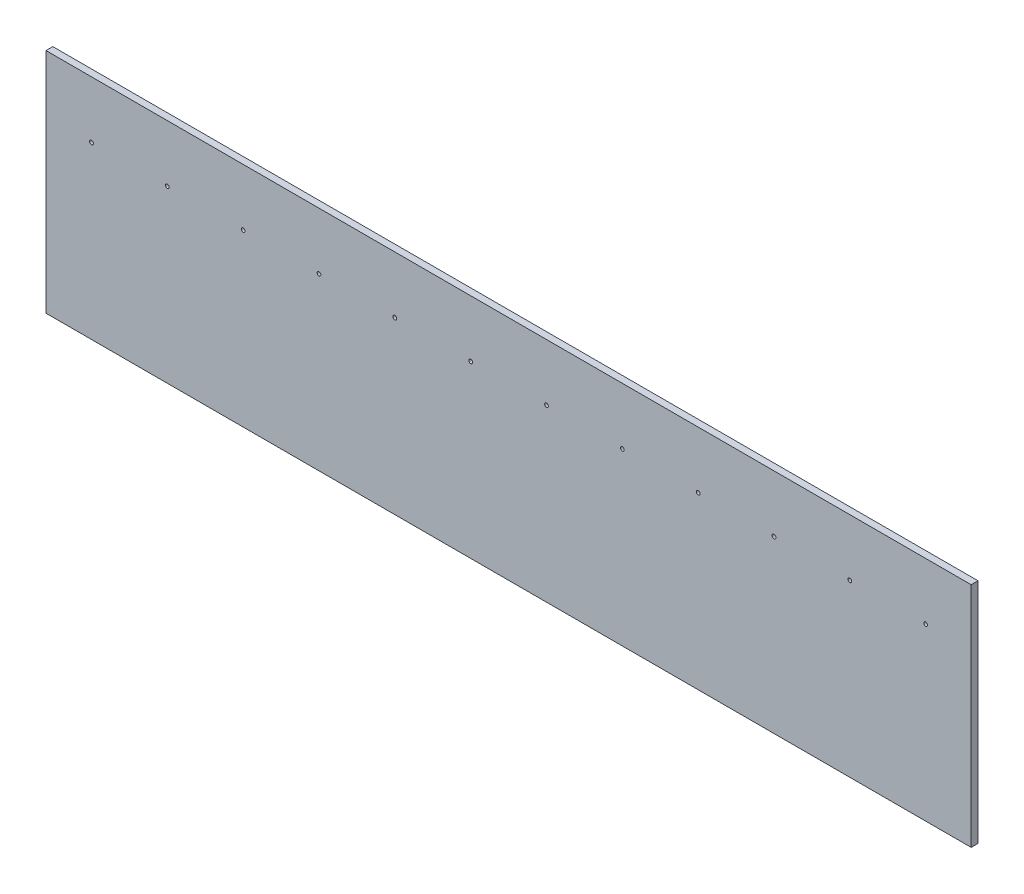
ISO-10303-21;
HEADER;
FILE_DESCRIPTION(('STEP AP214'),'2;1');
FILE_NAME('part.step','',(''),(''),'','','');
FILE_SCHEMA(('AUTOMOTIVE_DESIGN { 1 0 10303 214 1 1 1 1 }'));
ENDSEC;
DATA;
#1=APPLICATION_CONTEXT('core data for automotive mechanical design processes');
#2=APPLICATION_PROTOCOL_DEFINITION('international standard','automotive_design',2000,#1);
#3=PRODUCT_CONTEXT('',#1,'mechanical');
#4=PRODUCT('Part','Part','',(#3));
#5=PRODUCT_RELATED_PRODUCT_CATEGORY('part','',(#4));
#6=PRODUCT_DEFINITION_FORMATION('','',#4);
#7=PRODUCT_DEFINITION_CONTEXT('part definition',#1,'design');
#8=PRODUCT_DEFINITION('design','',#6,#7);
#9=PRODUCT_DEFINITION_SHAPE('','',#8);
#10=(LENGTH_UNIT() NAMED_UNIT(*) SI_UNIT(.MILLI.,.METRE.));
#11=(NAMED_UNIT(*) PLANE_ANGLE_UNIT() SI_UNIT($,.RADIAN.));
#12=(NAMED_UNIT(*) SI_UNIT($,.STERADIAN.) SOLID_ANGLE_UNIT());
#13=UNCERTAINTY_MEASURE_WITH_UNIT(LENGTH_MEASURE(1.E-05),#10,'distance_accuracy_value','');
#14=(GEOMETRIC_REPRESENTATION_CONTEXT(3) GLOBAL_UNCERTAINTY_ASSIGNED_CONTEXT((#13)) GLOBAL_UNIT_ASSIGNED_CONTEXT((#10,
#11,#12)) REPRESENTATION_CONTEXT('',''));
#15=CARTESIAN_POINT('',(0.,0.,0.));
#16=DIRECTION('',(0.,0.,1.));
#17=DIRECTION('',(1.,0.,0.));
#18=AXIS2_PLACEMENT_3D('',#15,#16,#17);
#19=CARTESIAN_POINT('',(0.,0.,18.));
#20=DIRECTION('',(0.,0.,-1.));
#21=DIRECTION('',(-1.,0.,0.));
#22=AXIS2_PLACEMENT_3D('',#19,#20,#21);
#23=PLANE('',#22);
#24=DIRECTION('',(0.,-1.,0.));
#25=VECTOR('',#24,1.);
#26=CARTESIAN_POINT('',(-789.743589743589,-341.025641025641,18.));
#27=LINE('',#26,#25);
#28=CARTESIAN_POINT('',(-789.743589743589,258.974358974359,18.));
#29=VERTEX_POINT('',#28);
#30=CARTESIAN_POINT('',(-789.743589743589,-341.025641025641,18.));
#31=VERTEX_POINT('',#30);
#32=EDGE_CURVE('E98',#29,#31,#27,.T.);
#33=ORIENTED_EDGE('',*,*,#32,.T.);
#34=DIRECTION('',(1.,0.,0.));
#35=VECTOR('',#34,1.);
#36=CARTESIAN_POINT('',(-789.743589743589,-341.025641025641,18.));
#37=LINE('',#36,#35);
#38=CARTESIAN_POINT('',(1650.25641025641,-341.025641025641,18.));
#39=VERTEX_POINT('',#38);
#40=EDGE_CURVE('E93',#31,#39,#37,.T.);
#41=ORIENTED_EDGE('',*,*,#40,.T.);
#42=DIRECTION('',(0.,1.,0.));
#43=VECTOR('',#42,1.);
#44=CARTESIAN_POINT('',(1650.25641025641,-341.025641025641,18.));
#45=LINE('',#44,#43);
#46=CARTESIAN_POINT('',(1650.25641025641,258.974358974359,18.));
#47=VERTEX_POINT('',#46);
#48=EDGE_CURVE('E96',#39,#47,#45,.T.);
#49=ORIENTED_EDGE('',*,*,#48,.T.);
#50=DIRECTION('',(-1.,0.,0.));
#51=VECTOR('',#50,1.);
#52=CARTESIAN_POINT('',(-789.743589743589,258.974358974359,18.));
#53=LINE('',#52,#51);
#54=EDGE_CURVE('E63',#47,#29,#53,.T.);
#55=ORIENTED_EDGE('',*,*,#54,.T.);
#56=EDGE_LOOP('',(#33,#41,#49,#55));
#57=FACE_BOUND('',#56,.T.);
#58=CARTESIAN_POINT('',(-669.743589743589,108.974358974359,18.));
#59=DIRECTION('',(0.,0.,1.));
#60=DIRECTION('',(1.,0.,0.));
#61=AXIS2_PLACEMENT_3D('',#58,#59,#60);
#62=CIRCLE('',#61,5.00000000000005);
#63=CARTESIAN_POINT('',(-664.743589743589,108.974358974359,18.));
#64=VERTEX_POINT('',#63);
#65=EDGE_CURVE('E118',#64,#64,#62,.T.);
#66=ORIENTED_EDGE('',*,*,#65,.F.);
#67=EDGE_LOOP('',(#66));
#68=FACE_BOUND('',#67,.T.);
#69=CARTESIAN_POINT('',(-469.743589743589,108.974358974359,18.));
#70=DIRECTION('',(0.,0.,1.));
#71=DIRECTION('',(1.,0.,0.));
#72=AXIS2_PLACEMENT_3D('',#69,#70,#71);
#73=CIRCLE('',#72,4.99999999999999);
#74=CARTESIAN_POINT('',(-464.743589743589,108.974358974359,18.));
#75=VERTEX_POINT('',#74);
#76=EDGE_CURVE('E140',#75,#75,#73,.T.);
#77=ORIENTED_EDGE('',*,*,#76,.F.);
#78=EDGE_LOOP('',(#77));
#79=FACE_BOUND('',#78,.T.);
#80=CARTESIAN_POINT('',(-269.743589743589,108.974358974359,18.));
#81=DIRECTION('',(0.,0.,1.));
#82=DIRECTION('',(1.,0.,0.));
#83=AXIS2_PLACEMENT_3D('',#80,#81,#82);
#84=CIRCLE('',#83,4.99999999999999);
#85=CARTESIAN_POINT('',(-264.743589743589,108.974358974359,18.));
#86=VERTEX_POINT('',#85);
#87=EDGE_CURVE('E148',#86,#86,#84,.T.);
#88=ORIENTED_EDGE('',*,*,#87,.F.);
#89=EDGE_LOOP('',(#88));
#90=FACE_BOUND('',#89,.T.);
#91=CARTESIAN_POINT('',(-69.7435897435892,108.974358974359,18.));
#92=DIRECTION('',(0.,0.,1.));
#93=DIRECTION('',(1.,0.,0.));
#94=AXIS2_PLACEMENT_3D('',#91,#92,#93);
#95=CIRCLE('',#94,5.00000000000001);
#96=CARTESIAN_POINT('',(-64.7435897435892,108.974358974359,18.));
#97=VERTEX_POINT('',#96);
#98=EDGE_CURVE('E156',#97,#97,#95,.T.);
#99=ORIENTED_EDGE('',*,*,#98,.F.);
#100=EDGE_LOOP('',(#99));
#101=FACE_BOUND('',#100,.T.);
#102=CARTESIAN_POINT('',(130.256410256411,108.974358974359,18.));
#103=DIRECTION('',(0.,0.,1.));
#104=DIRECTION('',(1.,0.,0.));
#105=AXIS2_PLACEMENT_3D('',#102,#103,#104);
#106=CIRCLE('',#105,4.99999999999999);
#107=CARTESIAN_POINT('',(135.256410256411,108.974358974359,18.));
#108=VERTEX_POINT('',#107);
#109=EDGE_CURVE('E164',#108,#108,#106,.T.);
#110=ORIENTED_EDGE('',*,*,#109,.F.);
#111=EDGE_LOOP('',(#110));
#112=FACE_BOUND('',#111,.T.);
#113=CARTESIAN_POINT('',(330.256410256411,108.974358974359,18.));
#114=DIRECTION('',(0.,0.,1.));
#115=DIRECTION('',(1.,0.,0.));
#116=AXIS2_PLACEMENT_3D('',#113,#114,#115);
#117=CIRCLE('',#116,4.99999999999999);
#118=CARTESIAN_POINT('',(335.256410256411,108.974358974359,18.));
#119=VERTEX_POINT('',#118);
#120=EDGE_CURVE('E172',#119,#119,#117,.T.);
#121=ORIENTED_EDGE('',*,*,#120,.F.);
#122=EDGE_LOOP('',(#121));
#123=FACE_BOUND('',#122,.T.);
#124=CARTESIAN_POINT('',(530.256410256411,108.974358974359,18.));
#125=DIRECTION('',(0.,0.,1.));
#126=DIRECTION('',(1.,0.,0.));
#127=AXIS2_PLACEMENT_3D('',#124,#125,#126);
#128=CIRCLE('',#127,5.00000000000005);
#129=CARTESIAN_POINT('',(535.256410256411,108.974358974359,18.));
#130=VERTEX_POINT('',#129);
#131=EDGE_CURVE('E180',#130,#130,#128,.T.);
#132=ORIENTED_EDGE('',*,*,#131,.F.);
#133=EDGE_LOOP('',(#132));
#134=FACE_BOUND('',#133,.T.);
#135=CARTESIAN_POINT('',(730.256410256411,108.974358974359,18.));
#136=DIRECTION('',(0.,0.,1.));
#137=DIRECTION('',(1.,0.,0.));
#138=AXIS2_PLACEMENT_3D('',#135,#136,#137);
#139=CIRCLE('',#138,5.00000000000005);
#140=CARTESIAN_POINT('',(735.256410256411,108.974358974359,18.));
#141=VERTEX_POINT('',#140);
#142=EDGE_CURVE('E188',#141,#141,#139,.T.);
#143=ORIENTED_EDGE('',*,*,#142,.F.);
#144=EDGE_LOOP('',(#143));
#145=FACE_BOUND('',#144,.T.);
#146=CARTESIAN_POINT('',(930.256410256411,108.974358974359,18.));
#147=DIRECTION('',(0.,0.,1.));
#148=DIRECTION('',(1.,0.,0.));
#149=AXIS2_PLACEMENT_3D('',#146,#147,#148);
#150=CIRCLE('',#149,5.00000000000005);
#151=CARTESIAN_POINT('',(935.256410256411,108.974358974359,18.));
#152=VERTEX_POINT('',#151);
#153=EDGE_CURVE('E196',#152,#152,#150,.T.);
#154=ORIENTED_EDGE('',*,*,#153,.F.);
#155=EDGE_LOOP('',(#154));
#156=FACE_BOUND('',#155,.T.);
#157=CARTESIAN_POINT('',(1130.25641025641,108.974358974359,18.));
#158=DIRECTION('',(0.,0.,1.));
#159=DIRECTION('',(1.,0.,0.));
#160=AXIS2_PLACEMENT_3D('',#157,#158,#159);
#161=CIRCLE('',#160,4.99999999999982);
#162=CARTESIAN_POINT('',(1135.25641025641,108.974358974359,18.));
#163=VERTEX_POINT('',#162);
#164=EDGE_CURVE('E204',#163,#163,#161,.T.);
#165=ORIENTED_EDGE('',*,*,#164,.F.);
#166=EDGE_LOOP('',(#165));
#167=FACE_BOUND('',#166,.T.);
#168=CARTESIAN_POINT('',(1330.25641025641,108.974358974359,18.));
#169=DIRECTION('',(0.,0.,1.));
#170=DIRECTION('',(1.,0.,0.));
#171=AXIS2_PLACEMENT_3D('',#168,#169,#170);
#172=CIRCLE('',#171,5.00000000000005);
#173=CARTESIAN_POINT('',(1335.25641025641,108.974358974359,18.));
#174=VERTEX_POINT('',#173);
#175=EDGE_CURVE('E212',#174,#174,#172,.T.);
#176=ORIENTED_EDGE('',*,*,#175,.F.);
#177=EDGE_LOOP('',(#176));
#178=FACE_BOUND('',#177,.T.);
#179=CARTESIAN_POINT('',(1530.25641025641,108.974358974359,18.));
#180=DIRECTION('',(0.,0.,1.));
#181=DIRECTION('',(1.,0.,0.));
#182=AXIS2_PLACEMENT_3D('',#179,#180,#181);
#183=CIRCLE('',#182,4.99999999999982);
#184=CARTESIAN_POINT('',(1535.25641025641,108.974358974359,18.));
#185=VERTEX_POINT('',#184);
#186=EDGE_CURVE('E220',#185,#185,#183,.T.);
#187=ORIENTED_EDGE('',*,*,#186,.F.);
#188=EDGE_LOOP('',(#187));
#189=FACE_BOUND('',#188,.T.);
#190=ADVANCED_FACE('F45',(#57,#68,#79,#90,#101,#112,#123,#134,#145,#156,#167,#178,#189),#23,.F.);
#191=CARTESIAN_POINT('',(0.,0.,0.));
#192=DIRECTION('',(0.,0.,-1.));
#193=DIRECTION('',(-1.,0.,0.));
#194=AXIS2_PLACEMENT_3D('',#191,#192,#193);
#195=PLANE('',#194);
#196=CARTESIAN_POINT('',(1330.25641025641,108.974358974359,0.));
#197=DIRECTION('',(0.,0.,1.));
#198=DIRECTION('',(1.,0.,0.));
#199=AXIS2_PLACEMENT_3D('',#196,#197,#198);
#200=CIRCLE('',#199,5.00000000000005);
#201=CARTESIAN_POINT('',(1335.25641025641,108.974358974359,0.));
#202=VERTEX_POINT('',#201);
#203=EDGE_CURVE('E216',#202,#202,#200,.T.);
#204=ORIENTED_EDGE('',*,*,#203,.T.);
#205=EDGE_LOOP('',(#204));
#206=FACE_BOUND('',#205,.T.);
#207=CARTESIAN_POINT('',(930.256410256411,108.974358974359,0.));
#208=DIRECTION('',(0.,0.,1.));
#209=DIRECTION('',(1.,0.,0.));
#210=AXIS2_PLACEMENT_3D('',#207,#208,#209);
#211=CIRCLE('',#210,5.00000000000005);
#212=CARTESIAN_POINT('',(935.256410256411,108.974358974359,0.));
#213=VERTEX_POINT('',#212);
#214=EDGE_CURVE('E200',#213,#213,#211,.T.);
#215=ORIENTED_EDGE('',*,*,#214,.T.);
#216=EDGE_LOOP('',(#215));
#217=FACE_BOUND('',#216,.T.);
#218=CARTESIAN_POINT('',(530.256410256411,108.974358974359,0.));
#219=DIRECTION('',(0.,0.,1.));
#220=DIRECTION('',(1.,0.,0.));
#221=AXIS2_PLACEMENT_3D('',#218,#219,#220);
#222=CIRCLE('',#221,5.00000000000005);
#223=CARTESIAN_POINT('',(535.256410256411,108.974358974359,0.));
#224=VERTEX_POINT('',#223);
#225=EDGE_CURVE('E184',#224,#224,#222,.T.);
#226=ORIENTED_EDGE('',*,*,#225,.T.);
#227=EDGE_LOOP('',(#226));
#228=FACE_BOUND('',#227,.T.);
#229=CARTESIAN_POINT('',(130.256410256411,108.974358974359,0.));
#230=DIRECTION('',(0.,0.,1.));
#231=DIRECTION('',(1.,0.,0.));
#232=AXIS2_PLACEMENT_3D('',#229,#230,#231);
#233=CIRCLE('',#232,4.99999999999999);
#234=CARTESIAN_POINT('',(135.256410256411,108.974358974359,0.));
#235=VERTEX_POINT('',#234);
#236=EDGE_CURVE('E168',#235,#235,#233,.T.);
#237=ORIENTED_EDGE('',*,*,#236,.T.);
#238=EDGE_LOOP('',(#237));
#239=FACE_BOUND('',#238,.T.);
#240=CARTESIAN_POINT('',(-269.743589743589,108.974358974359,0.));
#241=DIRECTION('',(0.,0.,1.));
#242=DIRECTION('',(1.,0.,0.));
#243=AXIS2_PLACEMENT_3D('',#240,#241,#242);
#244=CIRCLE('',#243,4.99999999999999);
#245=CARTESIAN_POINT('',(-264.743589743589,108.974358974359,0.));
#246=VERTEX_POINT('',#245);
#247=EDGE_CURVE('E152',#246,#246,#244,.T.);
#248=ORIENTED_EDGE('',*,*,#247,.T.);
#249=EDGE_LOOP('',(#248));
#250=FACE_BOUND('',#249,.T.);
#251=CARTESIAN_POINT('',(-669.743589743589,108.974358974359,0.));
#252=DIRECTION('',(0.,0.,1.));
#253=DIRECTION('',(1.,0.,0.));
#254=AXIS2_PLACEMENT_3D('',#251,#252,#253);
#255=CIRCLE('',#254,5.00000000000005);
#256=CARTESIAN_POINT('',(-664.743589743589,108.974358974359,0.));
#257=VERTEX_POINT('',#256);
#258=EDGE_CURVE('E136',#257,#257,#255,.T.);
#259=ORIENTED_EDGE('',*,*,#258,.T.);
#260=EDGE_LOOP('',(#259));
#261=FACE_BOUND('',#260,.T.);
#262=DIRECTION('',(0.,-1.,0.));
#263=VECTOR('',#262,1.);
#264=CARTESIAN_POINT('',(-789.743589743589,-341.025641025641,0.));
#265=LINE('',#264,#263);
#266=CARTESIAN_POINT('',(-789.743589743589,258.974358974359,0.));
#267=VERTEX_POINT('',#266);
#268=CARTESIAN_POINT('',(-789.743589743589,-341.025641025641,0.));
#269=VERTEX_POINT('',#268);
#270=EDGE_CURVE('E114',#267,#269,#265,.T.);
#271=ORIENTED_EDGE('',*,*,#270,.F.);
#272=DIRECTION('',(-1.,0.,0.));
#273=VECTOR('',#272,1.);
#274=CARTESIAN_POINT('',(-789.743589743589,258.974358974359,0.));
#275=LINE('',#274,#273);
#276=CARTESIAN_POINT('',(1650.25641025641,258.974358974359,0.));
#277=VERTEX_POINT('',#276);
#278=EDGE_CURVE('E86',#277,#267,#275,.T.);
#279=ORIENTED_EDGE('',*,*,#278,.F.);
#280=DIRECTION('',(0.,1.,0.));
#281=VECTOR('',#280,1.);
#282=CARTESIAN_POINT('',(1650.25641025641,-341.025641025641,0.));
#283=LINE('',#282,#281);
#284=CARTESIAN_POINT('',(1650.25641025641,-341.025641025641,0.));
#285=VERTEX_POINT('',#284);
#286=EDGE_CURVE('E80',#285,#277,#283,.T.);
#287=ORIENTED_EDGE('',*,*,#286,.F.);
#288=DIRECTION('',(1.,0.,0.));
#289=VECTOR('',#288,1.);
#290=CARTESIAN_POINT('',(-789.743589743589,-341.025641025641,0.));
#291=LINE('',#290,#289);
#292=EDGE_CURVE('E103',#269,#285,#291,.T.);
#293=ORIENTED_EDGE('',*,*,#292,.F.);
#294=EDGE_LOOP('',(#271,#279,#287,#293));
#295=FACE_BOUND('',#294,.T.);
#296=CARTESIAN_POINT('',(-469.743589743589,108.974358974359,0.));
#297=DIRECTION('',(0.,0.,1.));
#298=DIRECTION('',(1.,0.,0.));
#299=AXIS2_PLACEMENT_3D('',#296,#297,#298);
#300=CIRCLE('',#299,4.99999999999999);
#301=CARTESIAN_POINT('',(-464.743589743589,108.974358974359,0.));
#302=VERTEX_POINT('',#301);
#303=EDGE_CURVE('E144',#302,#302,#300,.T.);
#304=ORIENTED_EDGE('',*,*,#303,.T.);
#305=EDGE_LOOP('',(#304));
#306=FACE_BOUND('',#305,.T.);
#307=CARTESIAN_POINT('',(-69.7435897435892,108.974358974359,0.));
#308=DIRECTION('',(0.,0.,1.));
#309=DIRECTION('',(1.,0.,0.));
#310=AXIS2_PLACEMENT_3D('',#307,#308,#309);
#311=CIRCLE('',#310,5.00000000000001);
#312=CARTESIAN_POINT('',(-64.7435897435892,108.974358974359,0.));
#313=VERTEX_POINT('',#312);
#314=EDGE_CURVE('E160',#313,#313,#311,.T.);
#315=ORIENTED_EDGE('',*,*,#314,.T.);
#316=EDGE_LOOP('',(#315));
#317=FACE_BOUND('',#316,.T.);
#318=CARTESIAN_POINT('',(330.256410256411,108.974358974359,0.));
#319=DIRECTION('',(0.,0.,1.));
#320=DIRECTION('',(1.,0.,0.));
#321=AXIS2_PLACEMENT_3D('',#318,#319,#320);
#322=CIRCLE('',#321,4.99999999999999);
#323=CARTESIAN_POINT('',(335.256410256411,108.974358974359,0.));
#324=VERTEX_POINT('',#323);
#325=EDGE_CURVE('E176',#324,#324,#322,.T.);
#326=ORIENTED_EDGE('',*,*,#325,.T.);
#327=EDGE_LOOP('',(#326));
#328=FACE_BOUND('',#327,.T.);
#329=CARTESIAN_POINT('',(730.256410256411,108.974358974359,0.));
#330=DIRECTION('',(0.,0.,1.));
#331=DIRECTION('',(1.,0.,0.));
#332=AXIS2_PLACEMENT_3D('',#329,#330,#331);
#333=CIRCLE('',#332,5.00000000000005);
#334=CARTESIAN_POINT('',(735.256410256411,108.974358974359,0.));
#335=VERTEX_POINT('',#334);
#336=EDGE_CURVE('E192',#335,#335,#333,.T.);
#337=ORIENTED_EDGE('',*,*,#336,.T.);
#338=EDGE_LOOP('',(#337));
#339=FACE_BOUND('',#338,.T.);
#340=CARTESIAN_POINT('',(1130.25641025641,108.974358974359,0.));
#341=DIRECTION('',(0.,0.,1.));
#342=DIRECTION('',(1.,0.,0.));
#343=AXIS2_PLACEMENT_3D('',#340,#341,#342);
#344=CIRCLE('',#343,4.99999999999982);
#345=CARTESIAN_POINT('',(1135.25641025641,108.974358974359,0.));
#346=VERTEX_POINT('',#345);
#347=EDGE_CURVE('E208',#346,#346,#344,.T.);
#348=ORIENTED_EDGE('',*,*,#347,.T.);
#349=EDGE_LOOP('',(#348));
#350=FACE_BOUND('',#349,.T.);
#351=CARTESIAN_POINT('',(1530.25641025641,108.974358974359,0.));
#352=DIRECTION('',(0.,0.,1.));
#353=DIRECTION('',(1.,0.,0.));
#354=AXIS2_PLACEMENT_3D('',#351,#352,#353);
#355=CIRCLE('',#354,4.99999999999982);
#356=CARTESIAN_POINT('',(1535.25641025641,108.974358974359,0.));
#357=VERTEX_POINT('',#356);
#358=EDGE_CURVE('E224',#357,#357,#355,.T.);
#359=ORIENTED_EDGE('',*,*,#358,.T.);
#360=EDGE_LOOP('',(#359));
#361=FACE_BOUND('',#360,.T.);
#362=ADVANCED_FACE('F131',(#206,#217,#228,#239,#250,#261,#295,#306,#317,#328,#339,#350,#361),
#195,.T.);
#363=CARTESIAN_POINT('',(-789.743589743589,-341.025641025641,18.));
#364=DIRECTION('',(1.,0.,0.));
#365=DIRECTION('',(0.,0.,-1.));
#366=AXIS2_PLACEMENT_3D('',#363,#364,#365);
#367=PLANE('',#366);
#368=ORIENTED_EDGE('',*,*,#270,.T.);
#369=DIRECTION('',(0.,0.,-1.));
#370=VECTOR('',#369,1.);
#371=CARTESIAN_POINT('',(-789.743589743589,-341.025641025641,18.));
#372=LINE('',#371,#370);
#373=EDGE_CURVE('E11',#31,#269,#372,.T.);
#374=ORIENTED_EDGE('',*,*,#373,.F.);
#375=ORIENTED_EDGE('',*,*,#32,.F.);
#376=DIRECTION('',(0.,0.,-1.));
#377=VECTOR('',#376,1.);
#378=CARTESIAN_POINT('',(-789.743589743589,258.974358974359,18.));
#379=LINE('',#378,#377);
#380=EDGE_CURVE('E110',#29,#267,#379,.T.);
#381=ORIENTED_EDGE('',*,*,#380,.T.);
#382=EDGE_LOOP('',(#368,#374,#375,#381));
#383=FACE_BOUND('',#382,.T.);
#384=ADVANCED_FACE('F47',(#383),#367,.F.);
#385=CARTESIAN_POINT('',(-789.743589743589,-341.025641025641,18.));
#386=DIRECTION('',(0.,1.,0.));
#387=DIRECTION('',(-1.,0.,0.));
#388=AXIS2_PLACEMENT_3D('',#385,#386,#387);
#389=PLANE('',#388);
#390=ORIENTED_EDGE('',*,*,#292,.T.);
#391=DIRECTION('',(0.,0.,-1.));
#392=VECTOR('',#391,1.);
#393=CARTESIAN_POINT('',(1650.25641025641,-341.025641025641,18.));
#394=LINE('',#393,#392);
#395=EDGE_CURVE('E55',#39,#285,#394,.T.);
#396=ORIENTED_EDGE('',*,*,#395,.F.);
#397=ORIENTED_EDGE('',*,*,#40,.F.);
#398=ORIENTED_EDGE('',*,*,#373,.T.);
#399=EDGE_LOOP('',(#390,#396,#397,#398));
#400=FACE_BOUND('',#399,.T.);
#401=ADVANCED_FACE('F102',(#400),#389,.F.);
#402=CARTESIAN_POINT('',(1650.25641025641,-341.025641025641,18.));
#403=DIRECTION('',(-1.,0.,0.));
#404=DIRECTION('',(0.,0.,1.));
#405=AXIS2_PLACEMENT_3D('',#402,#403,#404);
#406=PLANE('',#405);
#407=ORIENTED_EDGE('',*,*,#286,.T.);
#408=DIRECTION('',(0.,0.,-1.));
#409=VECTOR('',#408,1.);
#410=CARTESIAN_POINT('',(1650.25641025641,258.974358974359,18.));
#411=LINE('',#410,#409);
#412=EDGE_CURVE('E105',#47,#277,#411,.T.);
#413=ORIENTED_EDGE('',*,*,#412,.F.);
#414=ORIENTED_EDGE('',*,*,#48,.F.);
#415=ORIENTED_EDGE('',*,*,#395,.T.);
#416=EDGE_LOOP('',(#407,#413,#414,#415));
#417=FACE_BOUND('',#416,.T.);
#418=ADVANCED_FACE('F106',(#417),#406,.F.);
#419=CARTESIAN_POINT('',(-789.743589743589,258.974358974359,18.));
#420=DIRECTION('',(0.,-1.,0.));
#421=DIRECTION('',(0.,0.,-1.));
#422=AXIS2_PLACEMENT_3D('',#419,#420,#421);
#423=PLANE('',#422);
#424=ORIENTED_EDGE('',*,*,#278,.T.);
#425=ORIENTED_EDGE('',*,*,#380,.F.);
#426=ORIENTED_EDGE('',*,*,#54,.F.);
#427=ORIENTED_EDGE('',*,*,#412,.T.);
#428=EDGE_LOOP('',(#424,#425,#426,#427));
#429=FACE_BOUND('',#428,.T.);
#430=ADVANCED_FACE('F128',(#429),#423,.F.);
#431=CARTESIAN_POINT('',(-669.743589743589,108.974358974359,18.));
#432=DIRECTION('',(0.,0.,-1.));
#433=DIRECTION('',(-1.,0.,0.));
#434=AXIS2_PLACEMENT_3D('',#431,#432,#433);
#435=CYLINDRICAL_SURFACE('',#434,5.00000000000005);
#436=ORIENTED_EDGE('',*,*,#65,.T.);
#437=EDGE_LOOP('',(#436));
#438=FACE_BOUND('',#437,.T.);
#439=ORIENTED_EDGE('',*,*,#258,.F.);
#440=EDGE_LOOP('',(#439));
#441=FACE_BOUND('',#440,.T.);
#442=ADVANCED_FACE('F243',(#438,#441),#435,.F.);
#443=CARTESIAN_POINT('',(-469.743589743589,108.974358974359,18.));
#444=DIRECTION('',(0.,0.,-1.));
#445=DIRECTION('',(-1.,0.,0.));
#446=AXIS2_PLACEMENT_3D('',#443,#444,#445);
#447=CYLINDRICAL_SURFACE('',#446,4.99999999999999);
#448=ORIENTED_EDGE('',*,*,#76,.T.);
#449=EDGE_LOOP('',(#448));
#450=FACE_BOUND('',#449,.T.);
#451=ORIENTED_EDGE('',*,*,#303,.F.);
#452=EDGE_LOOP('',(#451));
#453=FACE_BOUND('',#452,.T.);
#454=ADVANCED_FACE('F297',(#450,#453),#447,.F.);
#455=CARTESIAN_POINT('',(-269.743589743589,108.974358974359,18.));
#456=DIRECTION('',(0.,0.,-1.));
#457=DIRECTION('',(-1.,0.,0.));
#458=AXIS2_PLACEMENT_3D('',#455,#456,#457);
#459=CYLINDRICAL_SURFACE('',#458,4.99999999999999);
#460=ORIENTED_EDGE('',*,*,#87,.T.);
#461=EDGE_LOOP('',(#460));
#462=FACE_BOUND('',#461,.T.);
#463=ORIENTED_EDGE('',*,*,#247,.F.);
#464=EDGE_LOOP('',(#463));
#465=FACE_BOUND('',#464,.T.);
#466=ADVANCED_FACE('F306',(#462,#465),#459,.F.);
#467=CARTESIAN_POINT('',(-69.7435897435892,108.974358974359,18.));
#468=DIRECTION('',(0.,0.,-1.));
#469=DIRECTION('',(-1.,0.,0.));
#470=AXIS2_PLACEMENT_3D('',#467,#468,#469);
#471=CYLINDRICAL_SURFACE('',#470,5.00000000000001);
#472=ORIENTED_EDGE('',*,*,#98,.T.);
#473=EDGE_LOOP('',(#472));
#474=FACE_BOUND('',#473,.T.);
#475=ORIENTED_EDGE('',*,*,#314,.F.);
#476=EDGE_LOOP('',(#475));
#477=FACE_BOUND('',#476,.T.);
#478=ADVANCED_FACE('F315',(#474,#477),#471,.F.);
#479=CARTESIAN_POINT('',(130.256410256411,108.974358974359,18.));
#480=DIRECTION('',(0.,0.,-1.));
#481=DIRECTION('',(-1.,0.,0.));
#482=AXIS2_PLACEMENT_3D('',#479,#480,#481);
#483=CYLINDRICAL_SURFACE('',#482,4.99999999999999);
#484=ORIENTED_EDGE('',*,*,#109,.T.);
#485=EDGE_LOOP('',(#484));
#486=FACE_BOUND('',#485,.T.);
#487=ORIENTED_EDGE('',*,*,#236,.F.);
#488=EDGE_LOOP('',(#487));
#489=FACE_BOUND('',#488,.T.);
#490=ADVANCED_FACE('F325',(#486,#489),#483,.F.);
#491=CARTESIAN_POINT('',(330.256410256411,108.974358974359,18.));
#492=DIRECTION('',(0.,0.,-1.));
#493=DIRECTION('',(-1.,0.,0.));
#494=AXIS2_PLACEMENT_3D('',#491,#492,#493);
#495=CYLINDRICAL_SURFACE('',#494,4.99999999999999);
#496=ORIENTED_EDGE('',*,*,#120,.T.);
#497=EDGE_LOOP('',(#496));
#498=FACE_BOUND('',#497,.T.);
#499=ORIENTED_EDGE('',*,*,#325,.F.);
#500=EDGE_LOOP('',(#499));
#501=FACE_BOUND('',#500,.T.);
#502=ADVANCED_FACE('F335',(#498,#501),#495,.F.);
#503=CARTESIAN_POINT('',(530.256410256411,108.974358974359,18.));
#504=DIRECTION('',(0.,0.,-1.));
#505=DIRECTION('',(-1.,0.,0.));
#506=AXIS2_PLACEMENT_3D('',#503,#504,#505);
#507=CYLINDRICAL_SURFACE('',#506,5.00000000000005);
#508=ORIENTED_EDGE('',*,*,#131,.T.);
#509=EDGE_LOOP('',(#508));
#510=FACE_BOUND('',#509,.T.);
#511=ORIENTED_EDGE('',*,*,#225,.F.);
#512=EDGE_LOOP('',(#511));
#513=FACE_BOUND('',#512,.T.);
#514=ADVANCED_FACE('F345',(#510,#513),#507,.F.);
#515=CARTESIAN_POINT('',(730.256410256411,108.974358974359,18.));
#516=DIRECTION('',(0.,0.,-1.));
#517=DIRECTION('',(-1.,0.,0.));
#518=AXIS2_PLACEMENT_3D('',#515,#516,#517);
#519=CYLINDRICAL_SURFACE('',#518,5.00000000000005);
#520=ORIENTED_EDGE('',*,*,#142,.T.);
#521=EDGE_LOOP('',(#520));
#522=FACE_BOUND('',#521,.T.);
#523=ORIENTED_EDGE('',*,*,#336,.F.);
#524=EDGE_LOOP('',(#523));
#525=FACE_BOUND('',#524,.T.);
#526=ADVANCED_FACE('F355',(#522,#525),#519,.F.);
#527=CARTESIAN_POINT('',(930.256410256411,108.974358974359,18.));
#528=DIRECTION('',(0.,0.,-1.));
#529=DIRECTION('',(-1.,0.,0.));
#530=AXIS2_PLACEMENT_3D('',#527,#528,#529);
#531=CYLINDRICAL_SURFACE('',#530,5.00000000000005);
#532=ORIENTED_EDGE('',*,*,#153,.T.);
#533=EDGE_LOOP('',(#532));
#534=FACE_BOUND('',#533,.T.);
#535=ORIENTED_EDGE('',*,*,#214,.F.);
#536=EDGE_LOOP('',(#535));
#537=FACE_BOUND('',#536,.T.);
#538=ADVANCED_FACE('F365',(#534,#537),#531,.F.);
#539=CARTESIAN_POINT('',(1130.25641025641,108.974358974359,18.));
#540=DIRECTION('',(0.,0.,-1.));
#541=DIRECTION('',(-1.,0.,0.));
#542=AXIS2_PLACEMENT_3D('',#539,#540,#541);
#543=CYLINDRICAL_SURFACE('',#542,4.99999999999982);
#544=ORIENTED_EDGE('',*,*,#164,.T.);
#545=EDGE_LOOP('',(#544));
#546=FACE_BOUND('',#545,.T.);
#547=ORIENTED_EDGE('',*,*,#347,.F.);
#548=EDGE_LOOP('',(#547));
#549=FACE_BOUND('',#548,.T.);
#550=ADVANCED_FACE('F375',(#546,#549),#543,.F.);
#551=CARTESIAN_POINT('',(1330.25641025641,108.974358974359,18.));
#552=DIRECTION('',(0.,0.,-1.));
#553=DIRECTION('',(-1.,0.,0.));
#554=AXIS2_PLACEMENT_3D('',#551,#552,#553);
#555=CYLINDRICAL_SURFACE('',#554,5.00000000000005);
#556=ORIENTED_EDGE('',*,*,#175,.T.);
#557=EDGE_LOOP('',(#556));
#558=FACE_BOUND('',#557,.T.);
#559=ORIENTED_EDGE('',*,*,#203,.F.);
#560=EDGE_LOOP('',(#559));
#561=FACE_BOUND('',#560,.T.);
#562=ADVANCED_FACE('F385',(#558,#561),#555,.F.);
#563=CARTESIAN_POINT('',(1530.25641025641,108.974358974359,18.));
#564=DIRECTION('',(0.,0.,-1.));
#565=DIRECTION('',(-1.,0.,0.));
#566=AXIS2_PLACEMENT_3D('',#563,#564,#565);
#567=CYLINDRICAL_SURFACE('',#566,4.99999999999982);
#568=ORIENTED_EDGE('',*,*,#186,.T.);
#569=EDGE_LOOP('',(#568));
#570=FACE_BOUND('',#569,.T.);
#571=ORIENTED_EDGE('',*,*,#358,.F.);
#572=EDGE_LOOP('',(#571));
#573=FACE_BOUND('',#572,.T.);
#574=ADVANCED_FACE('F232',(#570,#573),#567,.F.);
#575=CLOSED_SHELL('',(#190,#362,#384,#401,#418,#430,#442,#454,#466,#478,#490,#502,#514,#526,
#538,#550,#562,#574));
#576=MANIFOLD_SOLID_BREP('B2',#575);
#577=ADVANCED_BREP_SHAPE_REPRESENTATION('',(#18,#576),#14);
#578=SHAPE_DEFINITION_REPRESENTATION(#9,#577);
ENDSEC;
END-ISO-10303-21;
